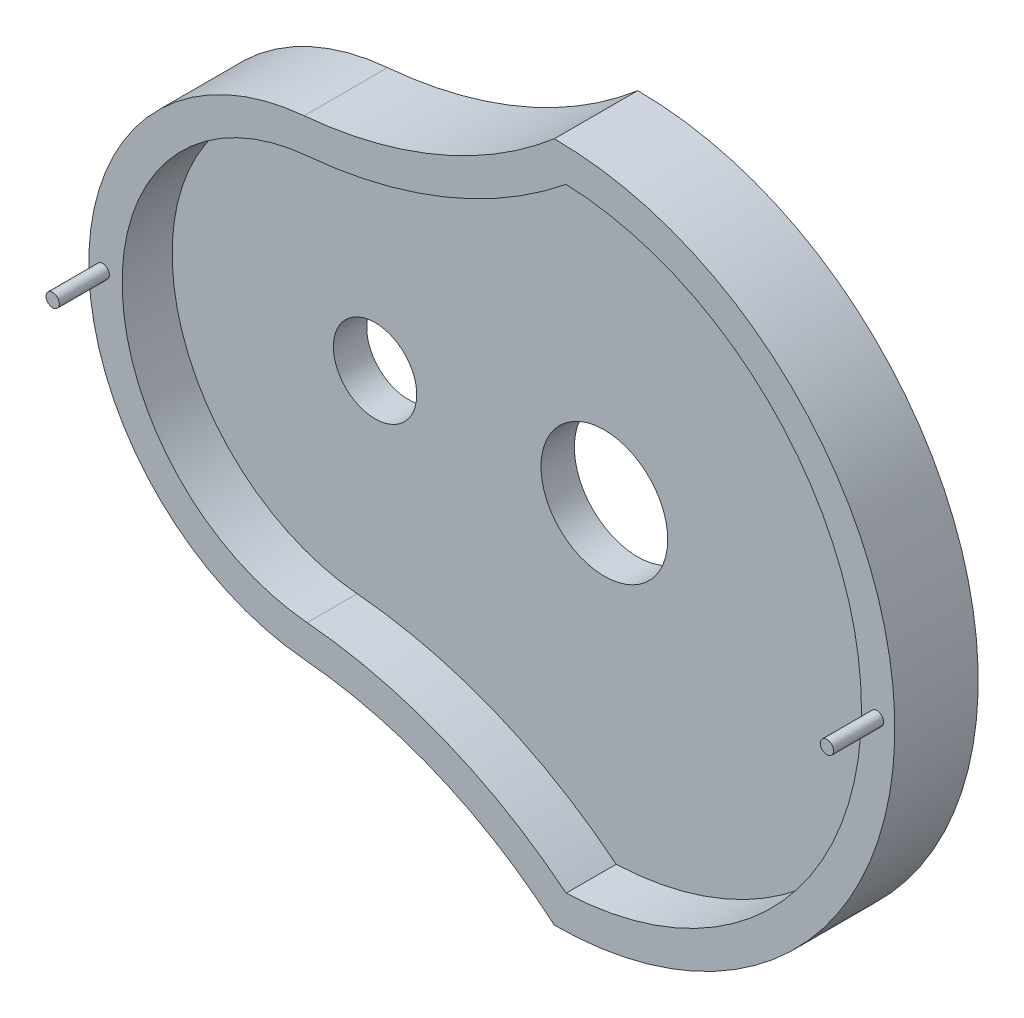
ISO-10303-21;
HEADER;
FILE_DESCRIPTION(('STEP AP214'),'2;1');
FILE_NAME('part.step','',(''),(''),'','','');
FILE_SCHEMA(('AUTOMOTIVE_DESIGN { 1 0 10303 214 1 1 1 1 }'));
ENDSEC;
DATA;
#1=APPLICATION_CONTEXT('core data for automotive mechanical design processes');
#2=APPLICATION_PROTOCOL_DEFINITION('international standard','automotive_design',2000,#1);
#3=PRODUCT_CONTEXT('',#1,'mechanical');
#4=PRODUCT('Part','Part','',(#3));
#5=PRODUCT_RELATED_PRODUCT_CATEGORY('part','',(#4));
#6=PRODUCT_DEFINITION_FORMATION('','',#4);
#7=PRODUCT_DEFINITION_CONTEXT('part definition',#1,'design');
#8=PRODUCT_DEFINITION('design','',#6,#7);
#9=PRODUCT_DEFINITION_SHAPE('','',#8);
#10=(LENGTH_UNIT() NAMED_UNIT(*) SI_UNIT(.MILLI.,.METRE.));
#11=(NAMED_UNIT(*) PLANE_ANGLE_UNIT() SI_UNIT($,.RADIAN.));
#12=(NAMED_UNIT(*) SI_UNIT($,.STERADIAN.) SOLID_ANGLE_UNIT());
#13=UNCERTAINTY_MEASURE_WITH_UNIT(LENGTH_MEASURE(1.E-05),#10,'distance_accuracy_value','');
#14=(GEOMETRIC_REPRESENTATION_CONTEXT(3) GLOBAL_UNCERTAINTY_ASSIGNED_CONTEXT((#13)) GLOBAL_UNIT_ASSIGNED_CONTEXT((#10,
#11,#12)) REPRESENTATION_CONTEXT('',''));
#15=CARTESIAN_POINT('',(0.,0.,0.));
#16=DIRECTION('',(0.,0.,1.));
#17=DIRECTION('',(1.,0.,0.));
#18=AXIS2_PLACEMENT_3D('',#15,#16,#17);
#19=CARTESIAN_POINT('',(-22.0423938438775,51.704240700986,6.35));
#20=DIRECTION('',(0.,0.,-1.));
#21=DIRECTION('',(-1.,0.,0.));
#22=AXIS2_PLACEMENT_3D('',#19,#20,#21);
#23=CYLINDRICAL_SURFACE('',#22,33.9145948689712);
#24=CARTESIAN_POINT('',(-22.0423938438775,51.704240700986,0.));
#25=DIRECTION('',(0.,0.,-1.));
#26=DIRECTION('',(1.,0.,0.));
#27=AXIS2_PLACEMENT_3D('',#24,#25,#26);
#28=CIRCLE('',#27,33.9145948689712);
#29=CARTESIAN_POINT('',(0.,25.92959,0.));
#30=VERTEX_POINT('',#29);
#31=CARTESIAN_POINT('',(-19.05,17.9219180423888,0.));
#32=VERTEX_POINT('',#31);
#33=EDGE_CURVE('E156',#30,#32,#28,.T.);
#34=ORIENTED_EDGE('',*,*,#33,.T.);
#35=DIRECTION('',(0.,0.,-1.));
#36=VECTOR('',#35,1.);
#37=CARTESIAN_POINT('',(-19.05,17.9219180423888,6.35));
#38=LINE('',#37,#36);
#39=CARTESIAN_POINT('',(-19.05,17.9219180423888,6.35));
#40=VERTEX_POINT('',#39);
#41=EDGE_CURVE('E45',#40,#32,#38,.T.);
#42=ORIENTED_EDGE('',*,*,#41,.F.);
#43=CARTESIAN_POINT('',(-22.0423938438775,51.704240700986,6.35));
#44=DIRECTION('',(0.,0.,-1.));
#45=DIRECTION('',(1.,0.,0.));
#46=AXIS2_PLACEMENT_3D('',#43,#44,#45);
#47=CIRCLE('',#46,33.9145948689712);
#48=CARTESIAN_POINT('',(0.,25.92959,6.35));
#49=VERTEX_POINT('',#48);
#50=EDGE_CURVE('E149',#49,#40,#47,.T.);
#51=ORIENTED_EDGE('',*,*,#50,.F.);
#52=DIRECTION('',(0.,0.,-1.));
#53=VECTOR('',#52,1.);
#54=CARTESIAN_POINT('',(0.,25.92959,6.35));
#55=LINE('',#54,#53);
#56=EDGE_CURVE('E154',#49,#30,#55,.T.);
#57=ORIENTED_EDGE('',*,*,#56,.T.);
#58=EDGE_LOOP('',(#34,#42,#51,#57));
#59=FACE_BOUND('',#58,.T.);
#60=ADVANCED_FACE('F39',(#59),#23,.F.);
#61=CARTESIAN_POINT('',(-17.4625,0.,6.35));
#62=DIRECTION('',(0.,0.,-1.));
#63=DIRECTION('',(-1.,0.,0.));
#64=AXIS2_PLACEMENT_3D('',#61,#62,#63);
#65=CYLINDRICAL_SURFACE('',#64,17.99209);
#66=CARTESIAN_POINT('',(-17.4625,0.,0.));
#67=DIRECTION('',(0.,0.,1.));
#68=DIRECTION('',(1.,0.,0.));
#69=AXIS2_PLACEMENT_3D('',#66,#67,#68);
#70=CIRCLE('',#69,17.99209);
#71=CARTESIAN_POINT('',(-19.05,-17.9219180423888,0.));
#72=VERTEX_POINT('',#71);
#73=EDGE_CURVE('E157',#32,#72,#70,.T.);
#74=ORIENTED_EDGE('',*,*,#73,.T.);
#75=DIRECTION('',(0.,0.,-1.));
#76=VECTOR('',#75,1.);
#77=CARTESIAN_POINT('',(-19.05,-17.9219180423888,6.35));
#78=LINE('',#77,#76);
#79=CARTESIAN_POINT('',(-19.05,-17.9219180423888,6.35));
#80=VERTEX_POINT('',#79);
#81=EDGE_CURVE('E167',#80,#72,#78,.T.);
#82=ORIENTED_EDGE('',*,*,#81,.F.);
#83=CARTESIAN_POINT('',(-17.4625,0.,6.35));
#84=DIRECTION('',(0.,0.,1.));
#85=DIRECTION('',(1.,0.,0.));
#86=AXIS2_PLACEMENT_3D('',#83,#84,#85);
#87=CIRCLE('',#86,17.99209);
#88=EDGE_CURVE('E91',#40,#80,#87,.T.);
#89=ORIENTED_EDGE('',*,*,#88,.F.);
#90=ORIENTED_EDGE('',*,*,#41,.T.);
#91=EDGE_LOOP('',(#74,#82,#89,#90));
#92=FACE_BOUND('',#91,.T.);
#93=ADVANCED_FACE('F201',(#92),#65,.T.);
#94=CARTESIAN_POINT('',(-22.0423938438776,-51.7042407009861,6.35));
#95=DIRECTION('',(0.,0.,-1.));
#96=DIRECTION('',(-1.,0.,0.));
#97=AXIS2_PLACEMENT_3D('',#94,#95,#96);
#98=CYLINDRICAL_SURFACE('',#97,33.9145948689713);
#99=CARTESIAN_POINT('',(-22.0423938438776,-51.7042407009861,0.));
#100=DIRECTION('',(0.,0.,-1.));
#101=DIRECTION('',(-1.,0.,0.));
#102=AXIS2_PLACEMENT_3D('',#99,#100,#101);
#103=CIRCLE('',#102,33.9145948689713);
#104=CARTESIAN_POINT('',(0.,-25.92959,0.));
#105=VERTEX_POINT('',#104);
#106=EDGE_CURVE('E161',#72,#105,#103,.T.);
#107=ORIENTED_EDGE('',*,*,#106,.T.);
#108=DIRECTION('',(0.,0.,-1.));
#109=VECTOR('',#108,1.);
#110=CARTESIAN_POINT('',(0.,-25.92959,6.35));
#111=LINE('',#110,#109);
#112=CARTESIAN_POINT('',(0.,-25.92959,6.35));
#113=VERTEX_POINT('',#112);
#114=EDGE_CURVE('E164',#113,#105,#111,.T.);
#115=ORIENTED_EDGE('',*,*,#114,.F.);
#116=CARTESIAN_POINT('',(-22.0423938438776,-51.7042407009861,6.35));
#117=DIRECTION('',(0.,0.,-1.));
#118=DIRECTION('',(-1.,0.,0.));
#119=AXIS2_PLACEMENT_3D('',#116,#117,#118);
#120=CIRCLE('',#119,33.9145948689713);
#121=EDGE_CURVE('E155',#80,#113,#120,.T.);
#122=ORIENTED_EDGE('',*,*,#121,.F.);
#123=ORIENTED_EDGE('',*,*,#81,.T.);
#124=EDGE_LOOP('',(#107,#115,#122,#123));
#125=FACE_BOUND('',#124,.T.);
#126=ADVANCED_FACE('F202',(#125),#98,.F.);
#127=CARTESIAN_POINT('',(0.,0.,6.35));
#128=DIRECTION('',(0.,0.,-1.));
#129=DIRECTION('',(-1.,0.,0.));
#130=AXIS2_PLACEMENT_3D('',#127,#128,#129);
#131=CYLINDRICAL_SURFACE('',#130,25.92959);
#132=CARTESIAN_POINT('',(0.,0.,0.));
#133=DIRECTION('',(0.,0.,1.));
#134=DIRECTION('',(1.,0.,0.));
#135=AXIS2_PLACEMENT_3D('',#132,#133,#134);
#136=CIRCLE('',#135,25.92959);
#137=EDGE_CURVE('E84',#105,#30,#136,.T.);
#138=ORIENTED_EDGE('',*,*,#137,.T.);
#139=ORIENTED_EDGE('',*,*,#56,.F.);
#140=CARTESIAN_POINT('',(0.,0.,6.35));
#141=DIRECTION('',(0.,0.,1.));
#142=DIRECTION('',(1.,0.,0.));
#143=AXIS2_PLACEMENT_3D('',#140,#141,#142);
#144=CIRCLE('',#143,25.92959);
#145=EDGE_CURVE('E63',#113,#49,#144,.T.);
#146=ORIENTED_EDGE('',*,*,#145,.F.);
#147=ORIENTED_EDGE('',*,*,#114,.T.);
#148=EDGE_LOOP('',(#138,#139,#146,#147));
#149=FACE_BOUND('',#148,.T.);
#150=ADVANCED_FACE('F198',(#149),#131,.T.);
#151=CARTESIAN_POINT('',(-11.0211969219388,25.852120350493,6.35));
#152=DIRECTION('',(0.,0.,1.));
#153=DIRECTION('',(1.,0.,0.));
#154=AXIS2_PLACEMENT_3D('',#151,#152,#153);
#155=PLANE('',#154);
#156=CARTESIAN_POINT('',(-34.3926840398212,0.,6.35));
#157=DIRECTION('',(0.,0.,1.));
#158=DIRECTION('',(1.,0.,0.));
#159=AXIS2_PLACEMENT_3D('',#156,#157,#158);
#160=CIRCLE('',#159,0.508000000000002);
#161=CARTESIAN_POINT('',(-33.8846840398212,0.,6.35));
#162=VERTEX_POINT('',#161);
#163=EDGE_CURVE('E11',#162,#162,#160,.T.);
#164=ORIENTED_EDGE('',*,*,#163,.F.);
#165=EDGE_LOOP('',(#164));
#166=FACE_BOUND('',#165,.T.);
#167=CARTESIAN_POINT('',(24.5691431426945,0.,6.35));
#168=DIRECTION('',(0.,0.,1.));
#169=DIRECTION('',(1.,0.,0.));
#170=AXIS2_PLACEMENT_3D('',#167,#168,#169);
#171=CIRCLE('',#170,0.508000000000002);
#172=CARTESIAN_POINT('',(25.0771431426945,0.,6.35));
#173=VERTEX_POINT('',#172);
#174=EDGE_CURVE('E50',#173,#173,#171,.T.);
#175=ORIENTED_EDGE('',*,*,#174,.F.);
#176=EDGE_LOOP('',(#175));
#177=FACE_BOUND('',#176,.T.);
#178=CARTESIAN_POINT('',(-22.0423938438775,51.704240700986,6.35));
#179=DIRECTION('',(0.,0.,1.));
#180=DIRECTION('',(1.,0.,0.));
#181=AXIS2_PLACEMENT_3D('',#178,#179,#180);
#182=CIRCLE('',#181,36.4545948689712);
#183=CARTESIAN_POINT('',(0.897573632694142,23.3723614969047,6.35));
#184=VERTEX_POINT('',#183);
#185=CARTESIAN_POINT('',(-18.8258876261735,15.3918244386069,6.35));
#186=VERTEX_POINT('',#185);
#187=EDGE_CURVE('E138',#184,#186,#182,.F.);
#188=ORIENTED_EDGE('',*,*,#187,.F.);
#189=CARTESIAN_POINT('',(0.,0.,6.35));
#190=DIRECTION('',(0.,0.,1.));
#191=DIRECTION('',(1.,0.,0.));
#192=AXIS2_PLACEMENT_3D('',#189,#190,#191);
#193=CIRCLE('',#192,23.38959);
#194=CARTESIAN_POINT('',(0.897573632694144,-23.3723614969047,6.35));
#195=VERTEX_POINT('',#194);
#196=EDGE_CURVE('E150',#195,#184,#193,.T.);
#197=ORIENTED_EDGE('',*,*,#196,.F.);
#198=CARTESIAN_POINT('',(-22.0423938438776,-51.7042407009861,6.35));
#199=DIRECTION('',(0.,0.,1.));
#200=DIRECTION('',(1.,0.,0.));
#201=AXIS2_PLACEMENT_3D('',#198,#199,#200);
#202=CIRCLE('',#201,36.4545948689713);
#203=CARTESIAN_POINT('',(-18.8258876261735,-15.3918244386069,6.35));
#204=VERTEX_POINT('',#203);
#205=EDGE_CURVE('E144',#204,#195,#202,.F.);
#206=ORIENTED_EDGE('',*,*,#205,.F.);
#207=CARTESIAN_POINT('',(-17.4625,0.,6.35));
#208=DIRECTION('',(0.,0.,1.));
#209=DIRECTION('',(1.,0.,0.));
#210=AXIS2_PLACEMENT_3D('',#207,#208,#209);
#211=CIRCLE('',#210,15.45209);
#212=EDGE_CURVE('E128',#186,#204,#211,.T.);
#213=ORIENTED_EDGE('',*,*,#212,.F.);
#214=EDGE_LOOP('',(#188,#197,#206,#213));
#215=FACE_BOUND('',#214,.T.);
#216=ORIENTED_EDGE('',*,*,#50,.T.);
#217=ORIENTED_EDGE('',*,*,#88,.T.);
#218=ORIENTED_EDGE('',*,*,#121,.T.);
#219=ORIENTED_EDGE('',*,*,#145,.T.);
#220=EDGE_LOOP('',(#216,#217,#218,#219));
#221=FACE_BOUND('',#220,.T.);
#222=ADVANCED_FACE('F193',(#166,#177,#215,#221),#155,.T.);
#223=CARTESIAN_POINT('',(-11.0211969219388,25.852120350493,0.));
#224=DIRECTION('',(0.,0.,1.));
#225=DIRECTION('',(1.,0.,0.));
#226=AXIS2_PLACEMENT_3D('',#223,#224,#225);
#227=PLANE('',#226);
#228=CARTESIAN_POINT('',(0.,0.,0.));
#229=DIRECTION('',(0.,0.,1.));
#230=DIRECTION('',(1.,0.,0.));
#231=AXIS2_PLACEMENT_3D('',#228,#229,#230);
#232=CIRCLE('',#231,4.826);
#233=CARTESIAN_POINT('',(4.826,0.,0.));
#234=VERTEX_POINT('',#233);
#235=EDGE_CURVE('E185',#234,#234,#232,.F.);
#236=ORIENTED_EDGE('',*,*,#235,.F.);
#237=EDGE_LOOP('',(#236));
#238=FACE_BOUND('',#237,.T.);
#239=CARTESIAN_POINT('',(-17.4625,0.,0.));
#240=DIRECTION('',(0.,0.,1.));
#241=DIRECTION('',(1.,0.,0.));
#242=AXIS2_PLACEMENT_3D('',#239,#240,#241);
#243=CIRCLE('',#242,3.175);
#244=CARTESIAN_POINT('',(-14.2875,0.,0.));
#245=VERTEX_POINT('',#244);
#246=EDGE_CURVE('E360',#245,#245,#243,.F.);
#247=ORIENTED_EDGE('',*,*,#246,.F.);
#248=EDGE_LOOP('',(#247));
#249=FACE_BOUND('',#248,.T.);
#250=ORIENTED_EDGE('',*,*,#33,.F.);
#251=ORIENTED_EDGE('',*,*,#137,.F.);
#252=ORIENTED_EDGE('',*,*,#106,.F.);
#253=ORIENTED_EDGE('',*,*,#73,.F.);
#254=EDGE_LOOP('',(#250,#251,#252,#253));
#255=FACE_BOUND('',#254,.T.);
#256=ADVANCED_FACE('F194',(#238,#249,#255),#227,.F.);
#257=CARTESIAN_POINT('',(-22.0423938438775,51.704240700986,6.35));
#258=DIRECTION('',(0.,0.,-1.));
#259=DIRECTION('',(-1.,0.,0.));
#260=AXIS2_PLACEMENT_3D('',#257,#258,#259);
#261=CYLINDRICAL_SURFACE('',#260,36.4545948689712);
#262=CARTESIAN_POINT('',(-22.0423938438775,51.704240700986,2.54));
#263=DIRECTION('',(0.,0.,1.));
#264=DIRECTION('',(1.,0.,0.));
#265=AXIS2_PLACEMENT_3D('',#262,#263,#264);
#266=CIRCLE('',#265,36.4545948689712);
#267=CARTESIAN_POINT('',(0.897573632694142,23.3723614969047,2.54));
#268=VERTEX_POINT('',#267);
#269=CARTESIAN_POINT('',(-18.8258876261735,15.3918244386069,2.54));
#270=VERTEX_POINT('',#269);
#271=EDGE_CURVE('E121',#268,#270,#266,.F.);
#272=ORIENTED_EDGE('',*,*,#271,.F.);
#273=DIRECTION('',(0.,0.,-1.));
#274=VECTOR('',#273,1.);
#275=CARTESIAN_POINT('',(0.897573632694142,23.3723614969047,6.35));
#276=LINE('',#275,#274);
#277=EDGE_CURVE('E143',#184,#268,#276,.T.);
#278=ORIENTED_EDGE('',*,*,#277,.F.);
#279=ORIENTED_EDGE('',*,*,#187,.T.);
#280=DIRECTION('',(0.,0.,-1.));
#281=VECTOR('',#280,1.);
#282=CARTESIAN_POINT('',(-18.8258876261735,15.3918244386069,6.35));
#283=LINE('',#282,#281);
#284=EDGE_CURVE('E135',#186,#270,#283,.T.);
#285=ORIENTED_EDGE('',*,*,#284,.T.);
#286=EDGE_LOOP('',(#272,#278,#279,#285));
#287=FACE_BOUND('',#286,.T.);
#288=ADVANCED_FACE('F191',(#287),#261,.T.);
#289=CARTESIAN_POINT('',(-17.4625,0.,6.35));
#290=DIRECTION('',(0.,0.,-1.));
#291=DIRECTION('',(-1.,0.,0.));
#292=AXIS2_PLACEMENT_3D('',#289,#290,#291);
#293=CYLINDRICAL_SURFACE('',#292,15.45209);
#294=CARTESIAN_POINT('',(-17.4625,0.,2.54));
#295=DIRECTION('',(0.,0.,1.));
#296=DIRECTION('',(1.,0.,0.));
#297=AXIS2_PLACEMENT_3D('',#294,#295,#296);
#298=CIRCLE('',#297,15.45209);
#299=CARTESIAN_POINT('',(-18.8258876261735,-15.3918244386069,2.54));
#300=VERTEX_POINT('',#299);
#301=EDGE_CURVE('E113',#270,#300,#298,.T.);
#302=ORIENTED_EDGE('',*,*,#301,.F.);
#303=ORIENTED_EDGE('',*,*,#284,.F.);
#304=ORIENTED_EDGE('',*,*,#212,.T.);
#305=DIRECTION('',(0.,0.,-1.));
#306=VECTOR('',#305,1.);
#307=CARTESIAN_POINT('',(-18.8258876261735,-15.3918244386069,6.35));
#308=LINE('',#307,#306);
#309=EDGE_CURVE('E130',#204,#300,#308,.T.);
#310=ORIENTED_EDGE('',*,*,#309,.T.);
#311=EDGE_LOOP('',(#302,#303,#304,#310));
#312=FACE_BOUND('',#311,.T.);
#313=ADVANCED_FACE('F126',(#312),#293,.F.);
#314=CARTESIAN_POINT('',(-22.0423938438776,-51.7042407009861,6.35));
#315=DIRECTION('',(0.,0.,-1.));
#316=DIRECTION('',(-1.,0.,0.));
#317=AXIS2_PLACEMENT_3D('',#314,#315,#316);
#318=CYLINDRICAL_SURFACE('',#317,36.4545948689713);
#319=CARTESIAN_POINT('',(-22.0423938438776,-51.7042407009861,2.54));
#320=DIRECTION('',(0.,0.,1.));
#321=DIRECTION('',(1.,0.,0.));
#322=AXIS2_PLACEMENT_3D('',#319,#320,#321);
#323=CIRCLE('',#322,36.4545948689713);
#324=CARTESIAN_POINT('',(0.897573632694144,-23.3723614969047,2.54));
#325=VERTEX_POINT('',#324);
#326=EDGE_CURVE('E118',#300,#325,#323,.F.);
#327=ORIENTED_EDGE('',*,*,#326,.F.);
#328=ORIENTED_EDGE('',*,*,#309,.F.);
#329=ORIENTED_EDGE('',*,*,#205,.T.);
#330=DIRECTION('',(0.,0.,-1.));
#331=VECTOR('',#330,1.);
#332=CARTESIAN_POINT('',(0.897573632694144,-23.3723614969047,6.35));
#333=LINE('',#332,#331);
#334=EDGE_CURVE('E54',#195,#325,#333,.T.);
#335=ORIENTED_EDGE('',*,*,#334,.T.);
#336=EDGE_LOOP('',(#327,#328,#329,#335));
#337=FACE_BOUND('',#336,.T.);
#338=ADVANCED_FACE('F132',(#337),#318,.T.);
#339=CARTESIAN_POINT('',(0.,0.,6.35));
#340=DIRECTION('',(0.,0.,-1.));
#341=DIRECTION('',(-1.,0.,0.));
#342=AXIS2_PLACEMENT_3D('',#339,#340,#341);
#343=CYLINDRICAL_SURFACE('',#342,23.38959);
#344=CARTESIAN_POINT('',(0.,0.,2.54));
#345=DIRECTION('',(0.,0.,1.));
#346=DIRECTION('',(1.,0.,0.));
#347=AXIS2_PLACEMENT_3D('',#344,#345,#346);
#348=CIRCLE('',#347,23.38959);
#349=EDGE_CURVE('E136',#325,#268,#348,.T.);
#350=ORIENTED_EDGE('',*,*,#349,.F.);
#351=ORIENTED_EDGE('',*,*,#334,.F.);
#352=ORIENTED_EDGE('',*,*,#196,.T.);
#353=ORIENTED_EDGE('',*,*,#277,.T.);
#354=EDGE_LOOP('',(#350,#351,#352,#353));
#355=FACE_BOUND('',#354,.T.);
#356=ADVANCED_FACE('F186',(#355),#343,.F.);
#357=CARTESIAN_POINT('',(-11.0211969219388,25.852120350493,2.54));
#358=DIRECTION('',(0.,0.,1.));
#359=DIRECTION('',(1.,0.,0.));
#360=AXIS2_PLACEMENT_3D('',#357,#358,#359);
#361=PLANE('',#360);
#362=CARTESIAN_POINT('',(0.,0.,2.54));
#363=DIRECTION('',(0.,0.,1.));
#364=DIRECTION('',(1.,0.,0.));
#365=AXIS2_PLACEMENT_3D('',#362,#363,#364);
#366=CIRCLE('',#365,4.826);
#367=CARTESIAN_POINT('',(4.826,0.,2.54));
#368=VERTEX_POINT('',#367);
#369=EDGE_CURVE('E351',#368,#368,#366,.T.);
#370=ORIENTED_EDGE('',*,*,#369,.F.);
#371=EDGE_LOOP('',(#370));
#372=FACE_BOUND('',#371,.T.);
#373=CARTESIAN_POINT('',(-17.4625,0.,2.54));
#374=DIRECTION('',(0.,0.,1.));
#375=DIRECTION('',(1.,0.,0.));
#376=AXIS2_PLACEMENT_3D('',#373,#374,#375);
#377=CIRCLE('',#376,3.175);
#378=CARTESIAN_POINT('',(-14.2875,0.,2.54));
#379=VERTEX_POINT('',#378);
#380=EDGE_CURVE('E355',#379,#379,#377,.T.);
#381=ORIENTED_EDGE('',*,*,#380,.F.);
#382=EDGE_LOOP('',(#381));
#383=FACE_BOUND('',#382,.T.);
#384=ORIENTED_EDGE('',*,*,#271,.T.);
#385=ORIENTED_EDGE('',*,*,#301,.T.);
#386=ORIENTED_EDGE('',*,*,#326,.T.);
#387=ORIENTED_EDGE('',*,*,#349,.T.);
#388=EDGE_LOOP('',(#384,#385,#386,#387));
#389=FACE_BOUND('',#388,.T.);
#390=ADVANCED_FACE('F116',(#372,#383,#389),#361,.T.);
#391=CARTESIAN_POINT('',(24.5691431426945,0.,10.16));
#392=DIRECTION('',(0.,0.,-1.));
#393=DIRECTION('',(-1.,0.,0.));
#394=AXIS2_PLACEMENT_3D('',#391,#392,#393);
#395=CYLINDRICAL_SURFACE('',#394,0.508000000000002);
#396=CARTESIAN_POINT('',(24.5691431426945,0.,10.16));
#397=DIRECTION('',(0.,0.,1.));
#398=DIRECTION('',(1.,0.,0.));
#399=AXIS2_PLACEMENT_3D('',#396,#397,#398);
#400=CIRCLE('',#399,0.508000000000002);
#401=CARTESIAN_POINT('',(25.0771431426945,0.,10.16));
#402=VERTEX_POINT('',#401);
#403=EDGE_CURVE('E178',#402,#402,#400,.T.);
#404=ORIENTED_EDGE('',*,*,#403,.F.);
#405=EDGE_LOOP('',(#404));
#406=FACE_BOUND('',#405,.T.);
#407=ORIENTED_EDGE('',*,*,#174,.T.);
#408=EDGE_LOOP('',(#407));
#409=FACE_BOUND('',#408,.T.);
#410=ADVANCED_FACE('F286',(#406,#409),#395,.T.);
#411=CARTESIAN_POINT('',(24.5691431426945,0.,10.16));
#412=DIRECTION('',(0.,0.,1.));
#413=DIRECTION('',(1.,0.,0.));
#414=AXIS2_PLACEMENT_3D('',#411,#412,#413);
#415=PLANE('',#414);
#416=ORIENTED_EDGE('',*,*,#403,.T.);
#417=EDGE_LOOP('',(#416));
#418=FACE_BOUND('',#417,.T.);
#419=ADVANCED_FACE('F299',(#418),#415,.T.);
#420=CARTESIAN_POINT('',(-34.3926840398212,0.,10.16));
#421=DIRECTION('',(0.,0.,-1.));
#422=DIRECTION('',(-1.,0.,0.));
#423=AXIS2_PLACEMENT_3D('',#420,#421,#422);
#424=CYLINDRICAL_SURFACE('',#423,0.508000000000002);
#425=CARTESIAN_POINT('',(-34.3926840398212,0.,10.16));
#426=DIRECTION('',(0.,0.,1.));
#427=DIRECTION('',(1.,0.,0.));
#428=AXIS2_PLACEMENT_3D('',#425,#426,#427);
#429=CIRCLE('',#428,0.508000000000002);
#430=CARTESIAN_POINT('',(-33.8846840398212,0.,10.16));
#431=VERTEX_POINT('',#430);
#432=EDGE_CURVE('E182',#431,#431,#429,.T.);
#433=ORIENTED_EDGE('',*,*,#432,.F.);
#434=EDGE_LOOP('',(#433));
#435=FACE_BOUND('',#434,.T.);
#436=ORIENTED_EDGE('',*,*,#163,.T.);
#437=EDGE_LOOP('',(#436));
#438=FACE_BOUND('',#437,.T.);
#439=ADVANCED_FACE('F308',(#435,#438),#424,.T.);
#440=CARTESIAN_POINT('',(-34.3926840398212,0.,10.16));
#441=DIRECTION('',(0.,0.,1.));
#442=DIRECTION('',(1.,0.,0.));
#443=AXIS2_PLACEMENT_3D('',#440,#441,#442);
#444=PLANE('',#443);
#445=ORIENTED_EDGE('',*,*,#432,.T.);
#446=EDGE_LOOP('',(#445));
#447=FACE_BOUND('',#446,.T.);
#448=ADVANCED_FACE('F316',(#447),#444,.T.);
#449=CARTESIAN_POINT('',(-17.4625,0.,-13.6499893040251));
#450=DIRECTION('',(0.,0.,1.));
#451=DIRECTION('',(1.,0.,0.));
#452=AXIS2_PLACEMENT_3D('',#449,#450,#451);
#453=CYLINDRICAL_SURFACE('',#452,3.175);
#454=ORIENTED_EDGE('',*,*,#246,.T.);
#455=EDGE_LOOP('',(#454));
#456=FACE_BOUND('',#455,.T.);
#457=ORIENTED_EDGE('',*,*,#380,.T.);
#458=EDGE_LOOP('',(#457));
#459=FACE_BOUND('',#458,.T.);
#460=ADVANCED_FACE('F324',(#456,#459),#453,.F.);
#461=CARTESIAN_POINT('',(0.,0.,-13.6499893040251));
#462=DIRECTION('',(0.,0.,1.));
#463=DIRECTION('',(1.,0.,0.));
#464=AXIS2_PLACEMENT_3D('',#461,#462,#463);
#465=CYLINDRICAL_SURFACE('',#464,4.826);
#466=ORIENTED_EDGE('',*,*,#235,.T.);
#467=EDGE_LOOP('',(#466));
#468=FACE_BOUND('',#467,.T.);
#469=ORIENTED_EDGE('',*,*,#369,.T.);
#470=EDGE_LOOP('',(#469));
#471=FACE_BOUND('',#470,.T.);
#472=ADVANCED_FACE('F331',(#468,#471),#465,.F.);
#473=CLOSED_SHELL('',(#60,#93,#126,#150,#222,#256,#288,#313,#338,#356,#390,#410,#419,#439,#448,
#460,#472));
#474=MANIFOLD_SOLID_BREP('B2',#473);
#475=ADVANCED_BREP_SHAPE_REPRESENTATION('',(#18,#474),#14);
#476=SHAPE_DEFINITION_REPRESENTATION(#9,#475);
ENDSEC;
END-ISO-10303-21;
